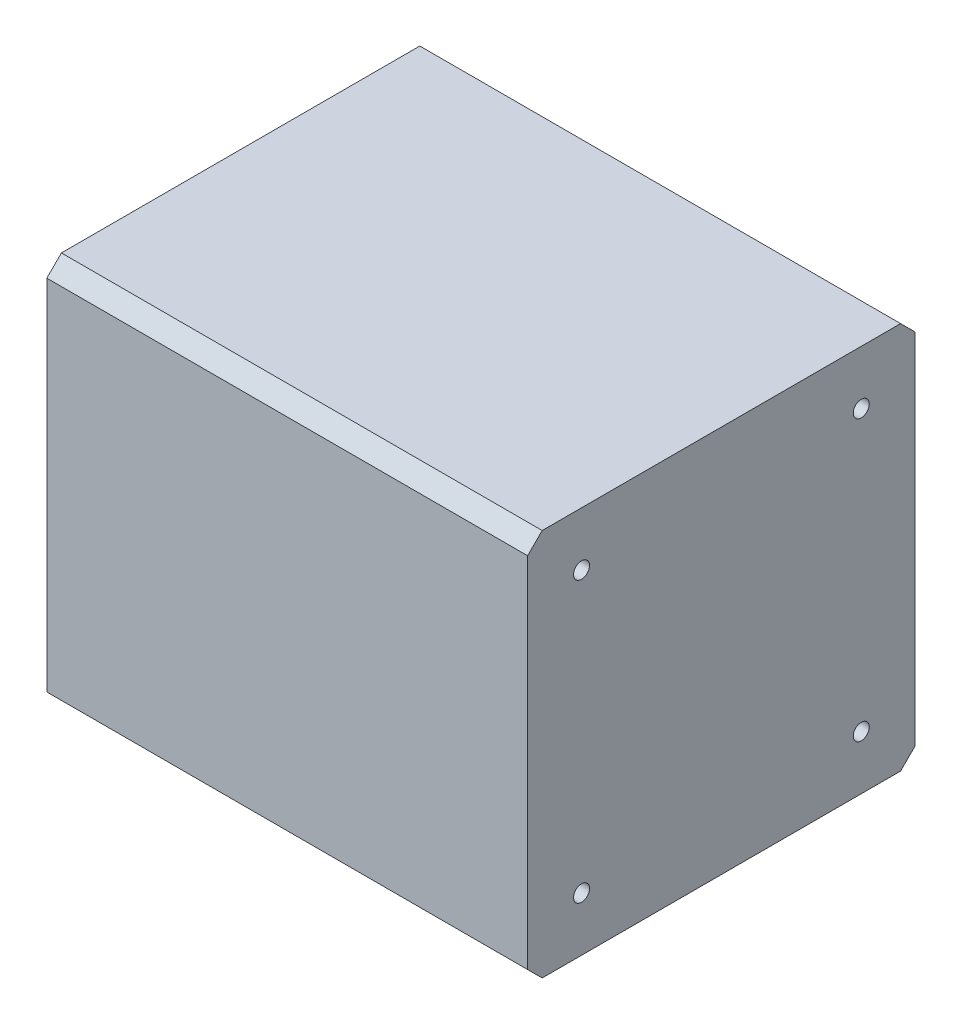
ISO-10303-21;
HEADER;
FILE_DESCRIPTION(('STEP AP214'),'2;1');
FILE_NAME('part.step','',(''),(''),'','','');
FILE_SCHEMA(('AUTOMOTIVE_DESIGN { 1 0 10303 214 1 1 1 1 }'));
ENDSEC;
DATA;
#1=APPLICATION_CONTEXT('core data for automotive mechanical design processes');
#2=APPLICATION_PROTOCOL_DEFINITION('international standard','automotive_design',2000,#1);
#3=PRODUCT_CONTEXT('',#1,'mechanical');
#4=PRODUCT('Part','Part','',(#3));
#5=PRODUCT_RELATED_PRODUCT_CATEGORY('part','',(#4));
#6=PRODUCT_DEFINITION_FORMATION('','',#4);
#7=PRODUCT_DEFINITION_CONTEXT('part definition',#1,'design');
#8=PRODUCT_DEFINITION('design','',#6,#7);
#9=PRODUCT_DEFINITION_SHAPE('','',#8);
#10=(LENGTH_UNIT() NAMED_UNIT(*) SI_UNIT(.MILLI.,.METRE.));
#11=(NAMED_UNIT(*) PLANE_ANGLE_UNIT() SI_UNIT($,.RADIAN.));
#12=(NAMED_UNIT(*) SI_UNIT($,.STERADIAN.) SOLID_ANGLE_UNIT());
#13=UNCERTAINTY_MEASURE_WITH_UNIT(LENGTH_MEASURE(1.E-05),#10,'distance_accuracy_value','');
#14=(GEOMETRIC_REPRESENTATION_CONTEXT(3) GLOBAL_UNCERTAINTY_ASSIGNED_CONTEXT((#13)) GLOBAL_UNIT_ASSIGNED_CONTEXT((#10,
#11,#12)) REPRESENTATION_CONTEXT('',''));
#15=CARTESIAN_POINT('',(0.,0.,0.));
#16=DIRECTION('',(0.,0.,1.));
#17=DIRECTION('',(1.,0.,0.));
#18=AXIS2_PLACEMENT_3D('',#15,#16,#17);
#19=CARTESIAN_POINT('',(0.,0.,0.));
#20=DIRECTION('',(1.,0.,0.));
#21=DIRECTION('',(0.,0.,-1.));
#22=AXIS2_PLACEMENT_3D('',#19,#20,#21);
#23=PLANE('',#22);
#24=DIRECTION('',(0.,0.,-1.));
#25=VECTOR('',#24,1.);
#26=CARTESIAN_POINT('',(0.,-66.5,66.5));
#27=LINE('',#26,#25);
#28=CARTESIAN_POINT('',(0.,-66.5,-20.));
#29=VERTEX_POINT('',#28);
#30=CARTESIAN_POINT('',(0.,-66.5,-61.5));
#31=VERTEX_POINT('',#30);
#32=EDGE_CURVE('E260',#29,#31,#27,.T.);
#33=ORIENTED_EDGE('',*,*,#32,.F.);
#34=DIRECTION('',(0.,-1.,0.));
#35=VECTOR('',#34,1.);
#36=CARTESIAN_POINT('',(0.,-56.5,-20.));
#37=LINE('',#36,#35);
#38=CARTESIAN_POINT('',(0.,-61.25,-20.));
#39=VERTEX_POINT('',#38);
#40=EDGE_CURVE('E185',#39,#29,#37,.T.);
#41=ORIENTED_EDGE('',*,*,#40,.F.);
#42=DIRECTION('',(0.,0.,-1.));
#43=VECTOR('',#42,1.);
#44=CARTESIAN_POINT('',(0.,-61.25,61.25));
#45=LINE('',#44,#43);
#46=CARTESIAN_POINT('',(0.,-61.25,-61.25));
#47=VERTEX_POINT('',#46);
#48=EDGE_CURVE('E239',#39,#47,#45,.T.);
#49=ORIENTED_EDGE('',*,*,#48,.T.);
#50=DIRECTION('',(0.,1.,0.));
#51=VECTOR('',#50,1.);
#52=CARTESIAN_POINT('',(0.,61.25,-61.25));
#53=LINE('',#52,#51);
#54=CARTESIAN_POINT('',(0.,61.25,-61.25));
#55=VERTEX_POINT('',#54);
#56=EDGE_CURVE('E243',#47,#55,#53,.T.);
#57=ORIENTED_EDGE('',*,*,#56,.T.);
#58=DIRECTION('',(0.,0.,1.));
#59=VECTOR('',#58,1.);
#60=CARTESIAN_POINT('',(0.,61.25,61.25));
#61=LINE('',#60,#59);
#62=CARTESIAN_POINT('',(0.,61.25,61.25));
#63=VERTEX_POINT('',#62);
#64=EDGE_CURVE('E227',#55,#63,#61,.T.);
#65=ORIENTED_EDGE('',*,*,#64,.T.);
#66=DIRECTION('',(0.,-1.,0.));
#67=VECTOR('',#66,1.);
#68=CARTESIAN_POINT('',(0.,61.25,61.25));
#69=LINE('',#68,#67);
#70=CARTESIAN_POINT('',(0.,-61.25,61.25));
#71=VERTEX_POINT('',#70);
#72=EDGE_CURVE('E222',#63,#71,#69,.T.);
#73=ORIENTED_EDGE('',*,*,#72,.T.);
#74=CARTESIAN_POINT('',(0.,-61.25,20.));
#75=VERTEX_POINT('',#74);
#76=EDGE_CURVE('E240',#71,#75,#45,.T.);
#77=ORIENTED_EDGE('',*,*,#76,.T.);
#78=DIRECTION('',(0.,-1.,0.));
#79=VECTOR('',#78,1.);
#80=CARTESIAN_POINT('',(0.,-56.5,20.));
#81=LINE('',#80,#79);
#82=CARTESIAN_POINT('',(0.,-66.5,20.));
#83=VERTEX_POINT('',#82);
#84=EDGE_CURVE('E59',#75,#83,#81,.T.);
#85=ORIENTED_EDGE('',*,*,#84,.T.);
#86=CARTESIAN_POINT('',(0.,-66.5,61.5));
#87=VERTEX_POINT('',#86);
#88=EDGE_CURVE('E179',#87,#83,#27,.T.);
#89=ORIENTED_EDGE('',*,*,#88,.F.);
#90=DIRECTION('',(0.,-0.707106781186549,-0.707106781186546));
#91=VECTOR('',#90,1.);
#92=CARTESIAN_POINT('',(0.,-66.5,61.5));
#93=LINE('',#92,#91);
#94=CARTESIAN_POINT('',(0.,-61.5,66.5));
#95=VERTEX_POINT('',#94);
#96=EDGE_CURVE('E277',#87,#95,#93,.F.);
#97=ORIENTED_EDGE('',*,*,#96,.T.);
#98=DIRECTION('',(0.,-1.,0.));
#99=VECTOR('',#98,1.);
#100=CARTESIAN_POINT('',(0.,66.5,66.5));
#101=LINE('',#100,#99);
#102=CARTESIAN_POINT('',(0.,61.5,66.5));
#103=VERTEX_POINT('',#102);
#104=EDGE_CURVE('E258',#103,#95,#101,.T.);
#105=ORIENTED_EDGE('',*,*,#104,.F.);
#106=DIRECTION('',(0.,-0.707106781186548,0.707106781186548));
#107=VECTOR('',#106,1.);
#108=CARTESIAN_POINT('',(0.,61.5,66.5));
#109=LINE('',#108,#107);
#110=CARTESIAN_POINT('',(0.,66.5,61.5));
#111=VERTEX_POINT('',#110);
#112=EDGE_CURVE('E273',#103,#111,#109,.F.);
#113=ORIENTED_EDGE('',*,*,#112,.T.);
#114=DIRECTION('',(0.,0.,1.));
#115=VECTOR('',#114,1.);
#116=CARTESIAN_POINT('',(0.,66.5,66.5));
#117=LINE('',#116,#115);
#118=CARTESIAN_POINT('',(0.,66.5,-61.5));
#119=VERTEX_POINT('',#118);
#120=EDGE_CURVE('E265',#119,#111,#117,.T.);
#121=ORIENTED_EDGE('',*,*,#120,.F.);
#122=DIRECTION('',(0.,0.707106781186549,0.707106781186546));
#123=VECTOR('',#122,1.);
#124=CARTESIAN_POINT('',(0.,66.5,-61.5));
#125=LINE('',#124,#123);
#126=CARTESIAN_POINT('',(0.,61.5,-66.5));
#127=VERTEX_POINT('',#126);
#128=EDGE_CURVE('E275',#119,#127,#125,.F.);
#129=ORIENTED_EDGE('',*,*,#128,.T.);
#130=DIRECTION('',(0.,1.,0.));
#131=VECTOR('',#130,1.);
#132=CARTESIAN_POINT('',(0.,66.5,-66.5));
#133=LINE('',#132,#131);
#134=CARTESIAN_POINT('',(0.,-61.5,-66.5));
#135=VERTEX_POINT('',#134);
#136=EDGE_CURVE('E262',#135,#127,#133,.T.);
#137=ORIENTED_EDGE('',*,*,#136,.F.);
#138=DIRECTION('',(0.,0.707106781186546,-0.707106781186549));
#139=VECTOR('',#138,1.);
#140=CARTESIAN_POINT('',(0.,-61.5,-66.5));
#141=LINE('',#140,#139);
#142=EDGE_CURVE('E279',#135,#31,#141,.F.);
#143=ORIENTED_EDGE('',*,*,#142,.T.);
#144=EDGE_LOOP('',(#33,#41,#49,#57,#65,#73,#77,#85,#89,#97,#105,#113,#121,#129,#137,#143));
#145=FACE_BOUND('',#144,.T.);
#146=ADVANCED_FACE('F43',(#145),#23,.F.);
#147=CARTESIAN_POINT('',(160.,66.5,66.5));
#148=DIRECTION('',(0.,0.,-1.));
#149=DIRECTION('',(0.,1.,0.));
#150=AXIS2_PLACEMENT_3D('',#147,#148,#149);
#151=PLANE('',#150);
#152=ORIENTED_EDGE('',*,*,#104,.T.);
#153=DIRECTION('',(1.,0.,0.));
#154=VECTOR('',#153,1.);
#155=CARTESIAN_POINT('',(160.,-61.5,66.5));
#156=LINE('',#155,#154);
#157=CARTESIAN_POINT('',(165.,-61.5,66.5));
#158=VERTEX_POINT('',#157);
#159=EDGE_CURVE('E67',#95,#158,#156,.T.);
#160=ORIENTED_EDGE('',*,*,#159,.T.);
#161=DIRECTION('',(0.,-1.,0.));
#162=VECTOR('',#161,1.);
#163=CARTESIAN_POINT('',(165.,66.5,66.5));
#164=LINE('',#163,#162);
#165=CARTESIAN_POINT('',(165.,61.5,66.5));
#166=VERTEX_POINT('',#165);
#167=EDGE_CURVE('E217',#166,#158,#164,.T.);
#168=ORIENTED_EDGE('',*,*,#167,.F.);
#169=DIRECTION('',(-1.,0.,0.));
#170=VECTOR('',#169,1.);
#171=CARTESIAN_POINT('',(160.,61.5,66.5));
#172=LINE('',#171,#170);
#173=EDGE_CURVE('E294',#166,#103,#172,.T.);
#174=ORIENTED_EDGE('',*,*,#173,.T.);
#175=EDGE_LOOP('',(#152,#160,#168,#174));
#176=FACE_BOUND('',#175,.T.);
#177=ADVANCED_FACE('F340',(#176),#151,.F.);
#178=CARTESIAN_POINT('',(160.,-66.5,66.5));
#179=DIRECTION('',(0.,1.,0.));
#180=DIRECTION('',(0.,0.,1.));
#181=AXIS2_PLACEMENT_3D('',#178,#179,#180);
#182=PLANE('',#181);
#183=CARTESIAN_POINT('',(40.,-66.5,0.));
#184=DIRECTION('',(0.,-1.,0.));
#185=DIRECTION('',(0.,0.,-1.));
#186=AXIS2_PLACEMENT_3D('',#183,#184,#185);
#187=CIRCLE('',#186,20.);
#188=CARTESIAN_POINT('',(40.,-66.5,-20.));
#189=VERTEX_POINT('',#188);
#190=CARTESIAN_POINT('',(40.,-66.5,20.));
#191=VERTEX_POINT('',#190);
#192=EDGE_CURVE('E167',#189,#191,#187,.T.);
#193=ORIENTED_EDGE('',*,*,#192,.F.);
#194=DIRECTION('',(1.,0.,0.));
#195=VECTOR('',#194,1.);
#196=CARTESIAN_POINT('',(40.,-66.5,-20.));
#197=LINE('',#196,#195);
#198=EDGE_CURVE('E164',#29,#189,#197,.T.);
#199=ORIENTED_EDGE('',*,*,#198,.F.);
#200=ORIENTED_EDGE('',*,*,#32,.T.);
#201=DIRECTION('',(1.,0.,0.));
#202=VECTOR('',#201,1.);
#203=CARTESIAN_POINT('',(160.,-66.5,-61.5));
#204=LINE('',#203,#202);
#205=CARTESIAN_POINT('',(165.,-66.5,-61.5));
#206=VERTEX_POINT('',#205);
#207=EDGE_CURVE('E284',#31,#206,#204,.T.);
#208=ORIENTED_EDGE('',*,*,#207,.T.);
#209=DIRECTION('',(0.,0.,-1.));
#210=VECTOR('',#209,1.);
#211=CARTESIAN_POINT('',(165.,-66.5,66.5));
#212=LINE('',#211,#210);
#213=CARTESIAN_POINT('',(165.,-66.5,61.5));
#214=VERTEX_POINT('',#213);
#215=EDGE_CURVE('E219',#214,#206,#212,.T.);
#216=ORIENTED_EDGE('',*,*,#215,.F.);
#217=DIRECTION('',(-1.,0.,0.));
#218=VECTOR('',#217,1.);
#219=CARTESIAN_POINT('',(160.,-66.5,61.5));
#220=LINE('',#219,#218);
#221=EDGE_CURVE('E282',#214,#87,#220,.T.);
#222=ORIENTED_EDGE('',*,*,#221,.T.);
#223=ORIENTED_EDGE('',*,*,#88,.T.);
#224=DIRECTION('',(-1.,0.,0.));
#225=VECTOR('',#224,1.);
#226=CARTESIAN_POINT('',(40.,-66.5,20.));
#227=LINE('',#226,#225);
#228=EDGE_CURVE('E160',#191,#83,#227,.T.);
#229=ORIENTED_EDGE('',*,*,#228,.F.);
#230=EDGE_LOOP('',(#193,#199,#200,#208,#216,#222,#223,#229));
#231=FACE_BOUND('',#230,.T.);
#232=ADVANCED_FACE('F176',(#231),#182,.F.);
#233=CARTESIAN_POINT('',(160.,66.5,-66.5));
#234=DIRECTION('',(0.,0.,1.));
#235=DIRECTION('',(0.,-1.,0.));
#236=AXIS2_PLACEMENT_3D('',#233,#234,#235);
#237=PLANE('',#236);
#238=DIRECTION('',(0.,1.,0.));
#239=VECTOR('',#238,1.);
#240=CARTESIAN_POINT('',(165.,-66.5,-66.5));
#241=LINE('',#240,#239);
#242=CARTESIAN_POINT('',(165.,-61.5,-66.5));
#243=VERTEX_POINT('',#242);
#244=CARTESIAN_POINT('',(165.,61.5,-66.5));
#245=VERTEX_POINT('',#244);
#246=EDGE_CURVE('E209',#243,#245,#241,.T.);
#247=ORIENTED_EDGE('',*,*,#246,.F.);
#248=DIRECTION('',(-1.,0.,0.));
#249=VECTOR('',#248,1.);
#250=CARTESIAN_POINT('',(160.,-61.5,-66.5));
#251=LINE('',#250,#249);
#252=EDGE_CURVE('E270',#243,#135,#251,.T.);
#253=ORIENTED_EDGE('',*,*,#252,.T.);
#254=ORIENTED_EDGE('',*,*,#136,.T.);
#255=DIRECTION('',(1.,0.,0.));
#256=VECTOR('',#255,1.);
#257=CARTESIAN_POINT('',(160.,61.5,-66.5));
#258=LINE('',#257,#256);
#259=EDGE_CURVE('E268',#127,#245,#258,.T.);
#260=ORIENTED_EDGE('',*,*,#259,.T.);
#261=EDGE_LOOP('',(#247,#253,#254,#260));
#262=FACE_BOUND('',#261,.T.);
#263=ADVANCED_FACE('F326',(#262),#237,.F.);
#264=CARTESIAN_POINT('',(160.,66.5,66.5));
#265=DIRECTION('',(0.,-1.,0.));
#266=DIRECTION('',(0.,0.,-1.));
#267=AXIS2_PLACEMENT_3D('',#264,#265,#266);
#268=PLANE('',#267);
#269=DIRECTION('',(0.,0.,1.));
#270=VECTOR('',#269,1.);
#271=CARTESIAN_POINT('',(165.,66.5,-66.5));
#272=LINE('',#271,#270);
#273=CARTESIAN_POINT('',(165.,66.5,-61.5));
#274=VERTEX_POINT('',#273);
#275=CARTESIAN_POINT('',(165.,66.5,61.5));
#276=VERTEX_POINT('',#275);
#277=EDGE_CURVE('E214',#274,#276,#272,.T.);
#278=ORIENTED_EDGE('',*,*,#277,.F.);
#279=DIRECTION('',(-1.,0.,0.));
#280=VECTOR('',#279,1.);
#281=CARTESIAN_POINT('',(160.,66.5,-61.5));
#282=LINE('',#281,#280);
#283=EDGE_CURVE('E300',#274,#119,#282,.T.);
#284=ORIENTED_EDGE('',*,*,#283,.T.);
#285=ORIENTED_EDGE('',*,*,#120,.T.);
#286=DIRECTION('',(1.,0.,0.));
#287=VECTOR('',#286,1.);
#288=CARTESIAN_POINT('',(160.,66.5,61.5));
#289=LINE('',#288,#287);
#290=EDGE_CURVE('E298',#111,#276,#289,.T.);
#291=ORIENTED_EDGE('',*,*,#290,.T.);
#292=EDGE_LOOP('',(#278,#284,#285,#291));
#293=FACE_BOUND('',#292,.T.);
#294=ADVANCED_FACE('F334',(#293),#268,.F.);
#295=CARTESIAN_POINT('',(160.,61.25,61.25));
#296=DIRECTION('',(0.,0.,-1.));
#297=DIRECTION('',(0.,1.,0.));
#298=AXIS2_PLACEMENT_3D('',#295,#296,#297);
#299=PLANE('',#298);
#300=ORIENTED_EDGE('',*,*,#72,.F.);
#301=DIRECTION('',(-1.,0.,0.));
#302=VECTOR('',#301,1.);
#303=CARTESIAN_POINT('',(160.,61.25,61.25));
#304=LINE('',#303,#302);
#305=CARTESIAN_POINT('',(160.,61.25,61.25));
#306=VERTEX_POINT('',#305);
#307=EDGE_CURVE('E236',#306,#63,#304,.T.);
#308=ORIENTED_EDGE('',*,*,#307,.F.);
#309=DIRECTION('',(0.,-1.,0.));
#310=VECTOR('',#309,1.);
#311=CARTESIAN_POINT('',(160.,61.25,61.25));
#312=LINE('',#311,#310);
#313=CARTESIAN_POINT('',(160.,-61.25,61.25));
#314=VERTEX_POINT('',#313);
#315=EDGE_CURVE('E223',#306,#314,#312,.T.);
#316=ORIENTED_EDGE('',*,*,#315,.T.);
#317=DIRECTION('',(-1.,0.,0.));
#318=VECTOR('',#317,1.);
#319=CARTESIAN_POINT('',(160.,-61.25,61.25));
#320=LINE('',#319,#318);
#321=EDGE_CURVE('E255',#314,#71,#320,.T.);
#322=ORIENTED_EDGE('',*,*,#321,.T.);
#323=EDGE_LOOP('',(#300,#308,#316,#322));
#324=FACE_BOUND('',#323,.T.);
#325=ADVANCED_FACE('F363',(#324),#299,.T.);
#326=CARTESIAN_POINT('',(160.,-61.25,61.25));
#327=DIRECTION('',(0.,1.,0.));
#328=DIRECTION('',(0.,0.,1.));
#329=AXIS2_PLACEMENT_3D('',#326,#327,#328);
#330=PLANE('',#329);
#331=DIRECTION('',(-1.,0.,0.));
#332=VECTOR('',#331,1.);
#333=CARTESIAN_POINT('',(160.,-61.25,-20.));
#334=LINE('',#333,#332);
#335=CARTESIAN_POINT('',(40.,-61.25,-20.));
#336=VERTEX_POINT('',#335);
#337=EDGE_CURVE('E11',#336,#39,#334,.T.);
#338=ORIENTED_EDGE('',*,*,#337,.F.);
#339=CARTESIAN_POINT('',(40.,-61.25,0.));
#340=DIRECTION('',(0.,1.,0.));
#341=DIRECTION('',(0.,0.,1.));
#342=AXIS2_PLACEMENT_3D('',#339,#340,#341);
#343=CIRCLE('',#342,20.);
#344=CARTESIAN_POINT('',(40.,-61.25,20.));
#345=VERTEX_POINT('',#344);
#346=EDGE_CURVE('E52',#345,#336,#343,.T.);
#347=ORIENTED_EDGE('',*,*,#346,.F.);
#348=DIRECTION('',(1.,0.,0.));
#349=VECTOR('',#348,1.);
#350=CARTESIAN_POINT('',(160.,-61.25,20.));
#351=LINE('',#350,#349);
#352=EDGE_CURVE('E161',#75,#345,#351,.T.);
#353=ORIENTED_EDGE('',*,*,#352,.F.);
#354=ORIENTED_EDGE('',*,*,#76,.F.);
#355=ORIENTED_EDGE('',*,*,#321,.F.);
#356=DIRECTION('',(0.,0.,-1.));
#357=VECTOR('',#356,1.);
#358=CARTESIAN_POINT('',(160.,-61.25,61.25));
#359=LINE('',#358,#357);
#360=CARTESIAN_POINT('',(160.,-61.25,-61.25));
#361=VERTEX_POINT('',#360);
#362=EDGE_CURVE('E226',#314,#361,#359,.T.);
#363=ORIENTED_EDGE('',*,*,#362,.T.);
#364=DIRECTION('',(-1.,0.,0.));
#365=VECTOR('',#364,1.);
#366=CARTESIAN_POINT('',(160.,-61.25,-61.25));
#367=LINE('',#366,#365);
#368=EDGE_CURVE('E252',#361,#47,#367,.T.);
#369=ORIENTED_EDGE('',*,*,#368,.T.);
#370=ORIENTED_EDGE('',*,*,#48,.F.);
#371=EDGE_LOOP('',(#338,#347,#353,#354,#355,#363,#369,#370));
#372=FACE_BOUND('',#371,.T.);
#373=ADVANCED_FACE('F309',(#372),#330,.T.);
#374=CARTESIAN_POINT('',(160.,61.25,-61.25));
#375=DIRECTION('',(0.,0.,1.));
#376=DIRECTION('',(0.,-1.,0.));
#377=AXIS2_PLACEMENT_3D('',#374,#375,#376);
#378=PLANE('',#377);
#379=ORIENTED_EDGE('',*,*,#56,.F.);
#380=ORIENTED_EDGE('',*,*,#368,.F.);
#381=DIRECTION('',(0.,1.,0.));
#382=VECTOR('',#381,1.);
#383=CARTESIAN_POINT('',(160.,61.25,-61.25));
#384=LINE('',#383,#382);
#385=CARTESIAN_POINT('',(160.,61.25,-61.25));
#386=VERTEX_POINT('',#385);
#387=EDGE_CURVE('E230',#361,#386,#384,.T.);
#388=ORIENTED_EDGE('',*,*,#387,.T.);
#389=DIRECTION('',(-1.,0.,0.));
#390=VECTOR('',#389,1.);
#391=CARTESIAN_POINT('',(160.,61.25,-61.25));
#392=LINE('',#391,#390);
#393=EDGE_CURVE('E250',#386,#55,#392,.T.);
#394=ORIENTED_EDGE('',*,*,#393,.T.);
#395=EDGE_LOOP('',(#379,#380,#388,#394));
#396=FACE_BOUND('',#395,.T.);
#397=ADVANCED_FACE('F390',(#396),#378,.T.);
#398=CARTESIAN_POINT('',(160.,61.25,61.25));
#399=DIRECTION('',(0.,-1.,0.));
#400=DIRECTION('',(0.,0.,-1.));
#401=AXIS2_PLACEMENT_3D('',#398,#399,#400);
#402=PLANE('',#401);
#403=ORIENTED_EDGE('',*,*,#64,.F.);
#404=ORIENTED_EDGE('',*,*,#393,.F.);
#405=DIRECTION('',(0.,0.,1.));
#406=VECTOR('',#405,1.);
#407=CARTESIAN_POINT('',(160.,61.25,61.25));
#408=LINE('',#407,#406);
#409=EDGE_CURVE('E233',#386,#306,#408,.T.);
#410=ORIENTED_EDGE('',*,*,#409,.T.);
#411=ORIENTED_EDGE('',*,*,#307,.T.);
#412=EDGE_LOOP('',(#403,#404,#410,#411));
#413=FACE_BOUND('',#412,.T.);
#414=ADVANCED_FACE('F435',(#413),#402,.T.);
#415=CARTESIAN_POINT('',(160.,0.,0.));
#416=DIRECTION('',(1.,0.,0.));
#417=DIRECTION('',(0.,0.,-1.));
#418=AXIS2_PLACEMENT_3D('',#415,#416,#417);
#419=PLANE('',#418);
#420=CARTESIAN_POINT('',(160.,48.,48.));
#421=DIRECTION('',(1.,0.,0.));
#422=DIRECTION('',(0.,0.,-1.));
#423=AXIS2_PLACEMENT_3D('',#420,#421,#422);
#424=CIRCLE('',#423,2.75);
#425=CARTESIAN_POINT('',(160.,48.,45.25));
#426=VERTEX_POINT('',#425);
#427=EDGE_CURVE('E201',#426,#426,#424,.T.);
#428=ORIENTED_EDGE('',*,*,#427,.T.);
#429=EDGE_LOOP('',(#428));
#430=FACE_BOUND('',#429,.T.);
#431=CARTESIAN_POINT('',(160.,-48.,48.));
#432=DIRECTION('',(1.,0.,0.));
#433=DIRECTION('',(0.,0.,-1.));
#434=AXIS2_PLACEMENT_3D('',#431,#432,#433);
#435=CIRCLE('',#434,2.75);
#436=CARTESIAN_POINT('',(160.,-48.,45.25));
#437=VERTEX_POINT('',#436);
#438=EDGE_CURVE('E195',#437,#437,#435,.T.);
#439=ORIENTED_EDGE('',*,*,#438,.T.);
#440=EDGE_LOOP('',(#439));
#441=FACE_BOUND('',#440,.T.);
#442=CARTESIAN_POINT('',(160.,-48.,-48.));
#443=DIRECTION('',(1.,0.,0.));
#444=DIRECTION('',(0.,0.,-1.));
#445=AXIS2_PLACEMENT_3D('',#442,#443,#444);
#446=CIRCLE('',#445,2.75);
#447=CARTESIAN_POINT('',(160.,-48.,-50.75));
#448=VERTEX_POINT('',#447);
#449=EDGE_CURVE('E188',#448,#448,#446,.T.);
#450=ORIENTED_EDGE('',*,*,#449,.T.);
#451=EDGE_LOOP('',(#450));
#452=FACE_BOUND('',#451,.T.);
#453=CARTESIAN_POINT('',(160.,48.,-48.));
#454=DIRECTION('',(1.,0.,0.));
#455=DIRECTION('',(0.,0.,-1.));
#456=AXIS2_PLACEMENT_3D('',#453,#454,#455);
#457=CIRCLE('',#456,2.75);
#458=CARTESIAN_POINT('',(160.,48.,-50.75));
#459=VERTEX_POINT('',#458);
#460=EDGE_CURVE('E206',#459,#459,#457,.T.);
#461=ORIENTED_EDGE('',*,*,#460,.T.);
#462=EDGE_LOOP('',(#461));
#463=FACE_BOUND('',#462,.T.);
#464=ORIENTED_EDGE('',*,*,#362,.F.);
#465=ORIENTED_EDGE('',*,*,#315,.F.);
#466=ORIENTED_EDGE('',*,*,#409,.F.);
#467=ORIENTED_EDGE('',*,*,#387,.F.);
#468=EDGE_LOOP('',(#464,#465,#466,#467));
#469=FACE_BOUND('',#468,.T.);
#470=ADVANCED_FACE('F431',(#430,#441,#452,#463,#469),#419,.F.);
#471=CARTESIAN_POINT('',(165.,0.,0.));
#472=DIRECTION('',(1.,0.,0.));
#473=DIRECTION('',(0.,0.,-1.));
#474=AXIS2_PLACEMENT_3D('',#471,#472,#473);
#475=PLANE('',#474);
#476=CARTESIAN_POINT('',(165.,48.,48.));
#477=DIRECTION('',(1.,0.,0.));
#478=DIRECTION('',(0.,0.,-1.));
#479=AXIS2_PLACEMENT_3D('',#476,#477,#478);
#480=CIRCLE('',#479,2.75);
#481=CARTESIAN_POINT('',(165.,48.,45.25));
#482=VERTEX_POINT('',#481);
#483=EDGE_CURVE('E184',#482,#482,#480,.T.);
#484=ORIENTED_EDGE('',*,*,#483,.F.);
#485=EDGE_LOOP('',(#484));
#486=FACE_BOUND('',#485,.T.);
#487=CARTESIAN_POINT('',(165.,-48.,48.));
#488=DIRECTION('',(1.,0.,0.));
#489=DIRECTION('',(0.,0.,-1.));
#490=AXIS2_PLACEMENT_3D('',#487,#488,#489);
#491=CIRCLE('',#490,2.75);
#492=CARTESIAN_POINT('',(165.,-48.,45.25));
#493=VERTEX_POINT('',#492);
#494=EDGE_CURVE('E198',#493,#493,#491,.T.);
#495=ORIENTED_EDGE('',*,*,#494,.F.);
#496=EDGE_LOOP('',(#495));
#497=FACE_BOUND('',#496,.T.);
#498=CARTESIAN_POINT('',(165.,-48.,-48.));
#499=DIRECTION('',(1.,0.,0.));
#500=DIRECTION('',(0.,0.,-1.));
#501=AXIS2_PLACEMENT_3D('',#498,#499,#500);
#502=CIRCLE('',#501,2.75);
#503=CARTESIAN_POINT('',(165.,-48.,-50.75));
#504=VERTEX_POINT('',#503);
#505=EDGE_CURVE('E192',#504,#504,#502,.T.);
#506=ORIENTED_EDGE('',*,*,#505,.F.);
#507=EDGE_LOOP('',(#506));
#508=FACE_BOUND('',#507,.T.);
#509=CARTESIAN_POINT('',(165.,48.,-48.));
#510=DIRECTION('',(1.,0.,0.));
#511=DIRECTION('',(0.,0.,-1.));
#512=AXIS2_PLACEMENT_3D('',#509,#510,#511);
#513=CIRCLE('',#512,2.75);
#514=CARTESIAN_POINT('',(165.,48.,-50.75));
#515=VERTEX_POINT('',#514);
#516=EDGE_CURVE('E191',#515,#515,#513,.T.);
#517=ORIENTED_EDGE('',*,*,#516,.F.);
#518=EDGE_LOOP('',(#517));
#519=FACE_BOUND('',#518,.T.);
#520=ORIENTED_EDGE('',*,*,#215,.T.);
#521=DIRECTION('',(0.,-0.707106781186546,0.707106781186549));
#522=VECTOR('',#521,1.);
#523=CARTESIAN_POINT('',(165.,-64.0000000000002,-63.9999999999998));
#524=LINE('',#523,#522);
#525=EDGE_CURVE('E292',#206,#243,#524,.F.);
#526=ORIENTED_EDGE('',*,*,#525,.T.);
#527=ORIENTED_EDGE('',*,*,#246,.T.);
#528=DIRECTION('',(0.,-0.707106781186549,-0.707106781186546));
#529=VECTOR('',#528,1.);
#530=CARTESIAN_POINT('',(165.,63.9999999999998,-64.0000000000002));
#531=LINE('',#530,#529);
#532=EDGE_CURVE('E288',#245,#274,#531,.F.);
#533=ORIENTED_EDGE('',*,*,#532,.T.);
#534=ORIENTED_EDGE('',*,*,#277,.T.);
#535=DIRECTION('',(0.,0.707106781186548,-0.707106781186548));
#536=VECTOR('',#535,1.);
#537=CARTESIAN_POINT('',(165.,64.,64.));
#538=LINE('',#537,#536);
#539=EDGE_CURVE('E286',#276,#166,#538,.F.);
#540=ORIENTED_EDGE('',*,*,#539,.T.);
#541=ORIENTED_EDGE('',*,*,#167,.T.);
#542=DIRECTION('',(0.,0.707106781186549,0.707106781186546));
#543=VECTOR('',#542,1.);
#544=CARTESIAN_POINT('',(165.,-63.9999999999998,64.0000000000002));
#545=LINE('',#544,#543);
#546=EDGE_CURVE('E290',#158,#214,#545,.F.);
#547=ORIENTED_EDGE('',*,*,#546,.T.);
#548=EDGE_LOOP('',(#520,#526,#527,#533,#534,#540,#541,#547));
#549=FACE_BOUND('',#548,.T.);
#550=ADVANCED_FACE('F323',(#486,#497,#508,#519,#549),#475,.T.);
#551=CARTESIAN_POINT('',(160.,-61.5,-66.5));
#552=DIRECTION('',(0.,0.707106781186549,0.707106781186545));
#553=DIRECTION('',(-1.,0.,0.));
#554=AXIS2_PLACEMENT_3D('',#551,#552,#553);
#555=PLANE('',#554);
#556=ORIENTED_EDGE('',*,*,#525,.F.);
#557=ORIENTED_EDGE('',*,*,#207,.F.);
#558=ORIENTED_EDGE('',*,*,#142,.F.);
#559=ORIENTED_EDGE('',*,*,#252,.F.);
#560=EDGE_LOOP('',(#556,#557,#558,#559));
#561=FACE_BOUND('',#560,.T.);
#562=ADVANCED_FACE('F320',(#561),#555,.F.);
#563=CARTESIAN_POINT('',(160.,-66.5,61.5));
#564=DIRECTION('',(0.,0.707106781186546,-0.707106781186549));
#565=DIRECTION('',(-1.,0.,0.));
#566=AXIS2_PLACEMENT_3D('',#563,#564,#565);
#567=PLANE('',#566);
#568=ORIENTED_EDGE('',*,*,#546,.F.);
#569=ORIENTED_EDGE('',*,*,#159,.F.);
#570=ORIENTED_EDGE('',*,*,#96,.F.);
#571=ORIENTED_EDGE('',*,*,#221,.F.);
#572=EDGE_LOOP('',(#568,#569,#570,#571));
#573=FACE_BOUND('',#572,.T.);
#574=ADVANCED_FACE('F344',(#573),#567,.F.);
#575=CARTESIAN_POINT('',(160.,66.5,-61.5));
#576=DIRECTION('',(0.,-0.707106781186545,0.707106781186549));
#577=DIRECTION('',(-1.,0.,0.));
#578=AXIS2_PLACEMENT_3D('',#575,#576,#577);
#579=PLANE('',#578);
#580=ORIENTED_EDGE('',*,*,#532,.F.);
#581=ORIENTED_EDGE('',*,*,#259,.F.);
#582=ORIENTED_EDGE('',*,*,#128,.F.);
#583=ORIENTED_EDGE('',*,*,#283,.F.);
#584=EDGE_LOOP('',(#580,#581,#582,#583));
#585=FACE_BOUND('',#584,.T.);
#586=ADVANCED_FACE('F329',(#585),#579,.F.);
#587=CARTESIAN_POINT('',(160.,61.5,66.5));
#588=DIRECTION('',(0.,-0.707106781186548,-0.707106781186548));
#589=DIRECTION('',(-1.,0.,0.));
#590=AXIS2_PLACEMENT_3D('',#587,#588,#589);
#591=PLANE('',#590);
#592=ORIENTED_EDGE('',*,*,#539,.F.);
#593=ORIENTED_EDGE('',*,*,#290,.F.);
#594=ORIENTED_EDGE('',*,*,#112,.F.);
#595=ORIENTED_EDGE('',*,*,#173,.F.);
#596=EDGE_LOOP('',(#592,#593,#594,#595));
#597=FACE_BOUND('',#596,.T.);
#598=ADVANCED_FACE('F46',(#597),#591,.F.);
#599=CARTESIAN_POINT('',(160.,48.,-48.));
#600=DIRECTION('',(1.,0.,0.));
#601=DIRECTION('',(0.,0.,-1.));
#602=AXIS2_PLACEMENT_3D('',#599,#600,#601);
#603=CYLINDRICAL_SURFACE('',#602,2.75);
#604=ORIENTED_EDGE('',*,*,#460,.F.);
#605=EDGE_LOOP('',(#604));
#606=FACE_BOUND('',#605,.T.);
#607=ORIENTED_EDGE('',*,*,#516,.T.);
#608=EDGE_LOOP('',(#607));
#609=FACE_BOUND('',#608,.T.);
#610=ADVANCED_FACE('F419',(#606,#609),#603,.F.);
#611=CARTESIAN_POINT('',(160.,-48.,-48.));
#612=DIRECTION('',(1.,0.,0.));
#613=DIRECTION('',(0.,0.,-1.));
#614=AXIS2_PLACEMENT_3D('',#611,#612,#613);
#615=CYLINDRICAL_SURFACE('',#614,2.75);
#616=ORIENTED_EDGE('',*,*,#449,.F.);
#617=EDGE_LOOP('',(#616));
#618=FACE_BOUND('',#617,.T.);
#619=ORIENTED_EDGE('',*,*,#505,.T.);
#620=EDGE_LOOP('',(#619));
#621=FACE_BOUND('',#620,.T.);
#622=ADVANCED_FACE('F415',(#618,#621),#615,.F.);
#623=CARTESIAN_POINT('',(160.,-48.,48.));
#624=DIRECTION('',(1.,0.,0.));
#625=DIRECTION('',(0.,0.,-1.));
#626=AXIS2_PLACEMENT_3D('',#623,#624,#625);
#627=CYLINDRICAL_SURFACE('',#626,2.75);
#628=ORIENTED_EDGE('',*,*,#438,.F.);
#629=EDGE_LOOP('',(#628));
#630=FACE_BOUND('',#629,.T.);
#631=ORIENTED_EDGE('',*,*,#494,.T.);
#632=EDGE_LOOP('',(#631));
#633=FACE_BOUND('',#632,.T.);
#634=ADVANCED_FACE('F418',(#630,#633),#627,.F.);
#635=CARTESIAN_POINT('',(160.,48.,48.));
#636=DIRECTION('',(1.,0.,0.));
#637=DIRECTION('',(0.,0.,-1.));
#638=AXIS2_PLACEMENT_3D('',#635,#636,#637);
#639=CYLINDRICAL_SURFACE('',#638,2.75);
#640=ORIENTED_EDGE('',*,*,#427,.F.);
#641=EDGE_LOOP('',(#640));
#642=FACE_BOUND('',#641,.T.);
#643=ORIENTED_EDGE('',*,*,#483,.T.);
#644=EDGE_LOOP('',(#643));
#645=FACE_BOUND('',#644,.T.);
#646=ADVANCED_FACE('F398',(#642,#645),#639,.F.);
#647=CARTESIAN_POINT('',(40.,-56.5,0.));
#648=DIRECTION('',(0.,-1.,0.));
#649=DIRECTION('',(0.,0.,-1.));
#650=AXIS2_PLACEMENT_3D('',#647,#648,#649);
#651=CYLINDRICAL_SURFACE('',#650,20.);
#652=ORIENTED_EDGE('',*,*,#346,.T.);
#653=DIRECTION('',(0.,-1.,0.));
#654=VECTOR('',#653,1.);
#655=CARTESIAN_POINT('',(40.,-56.5,-20.));
#656=LINE('',#655,#654);
#657=EDGE_CURVE('E170',#336,#189,#656,.T.);
#658=ORIENTED_EDGE('',*,*,#657,.T.);
#659=ORIENTED_EDGE('',*,*,#192,.T.);
#660=DIRECTION('',(0.,-1.,0.));
#661=VECTOR('',#660,1.);
#662=CARTESIAN_POINT('',(40.,-56.5,20.));
#663=LINE('',#662,#661);
#664=EDGE_CURVE('E156',#345,#191,#663,.T.);
#665=ORIENTED_EDGE('',*,*,#664,.F.);
#666=EDGE_LOOP('',(#652,#658,#659,#665));
#667=FACE_BOUND('',#666,.T.);
#668=ADVANCED_FACE('F168',(#667),#651,.F.);
#669=CARTESIAN_POINT('',(40.,-56.5,-20.));
#670=DIRECTION('',(0.,0.,-1.));
#671=DIRECTION('',(-1.,0.,0.));
#672=AXIS2_PLACEMENT_3D('',#669,#670,#671);
#673=PLANE('',#672);
#674=ORIENTED_EDGE('',*,*,#337,.T.);
#675=ORIENTED_EDGE('',*,*,#40,.T.);
#676=ORIENTED_EDGE('',*,*,#198,.T.);
#677=ORIENTED_EDGE('',*,*,#657,.F.);
#678=EDGE_LOOP('',(#674,#675,#676,#677));
#679=FACE_BOUND('',#678,.T.);
#680=ADVANCED_FACE('F306',(#679),#673,.F.);
#681=CARTESIAN_POINT('',(40.,-56.5,20.));
#682=DIRECTION('',(0.,0.,1.));
#683=DIRECTION('',(1.,0.,0.));
#684=AXIS2_PLACEMENT_3D('',#681,#682,#683);
#685=PLANE('',#684);
#686=ORIENTED_EDGE('',*,*,#352,.T.);
#687=ORIENTED_EDGE('',*,*,#664,.T.);
#688=ORIENTED_EDGE('',*,*,#228,.T.);
#689=ORIENTED_EDGE('',*,*,#84,.F.);
#690=EDGE_LOOP('',(#686,#687,#688,#689));
#691=FACE_BOUND('',#690,.T.);
#692=ADVANCED_FACE('F158',(#691),#685,.F.);
#693=CLOSED_SHELL('',(#146,#177,#232,#263,#294,#325,#373,#397,#414,#470,#550,#562,#574,#586,
#598,#610,#622,#634,#646,#668,#680,#692));
#694=MANIFOLD_SOLID_BREP('B2',#693);
#695=ADVANCED_BREP_SHAPE_REPRESENTATION('',(#18,#694),#14);
#696=SHAPE_DEFINITION_REPRESENTATION(#9,#695);
ENDSEC;
END-ISO-10303-21;
